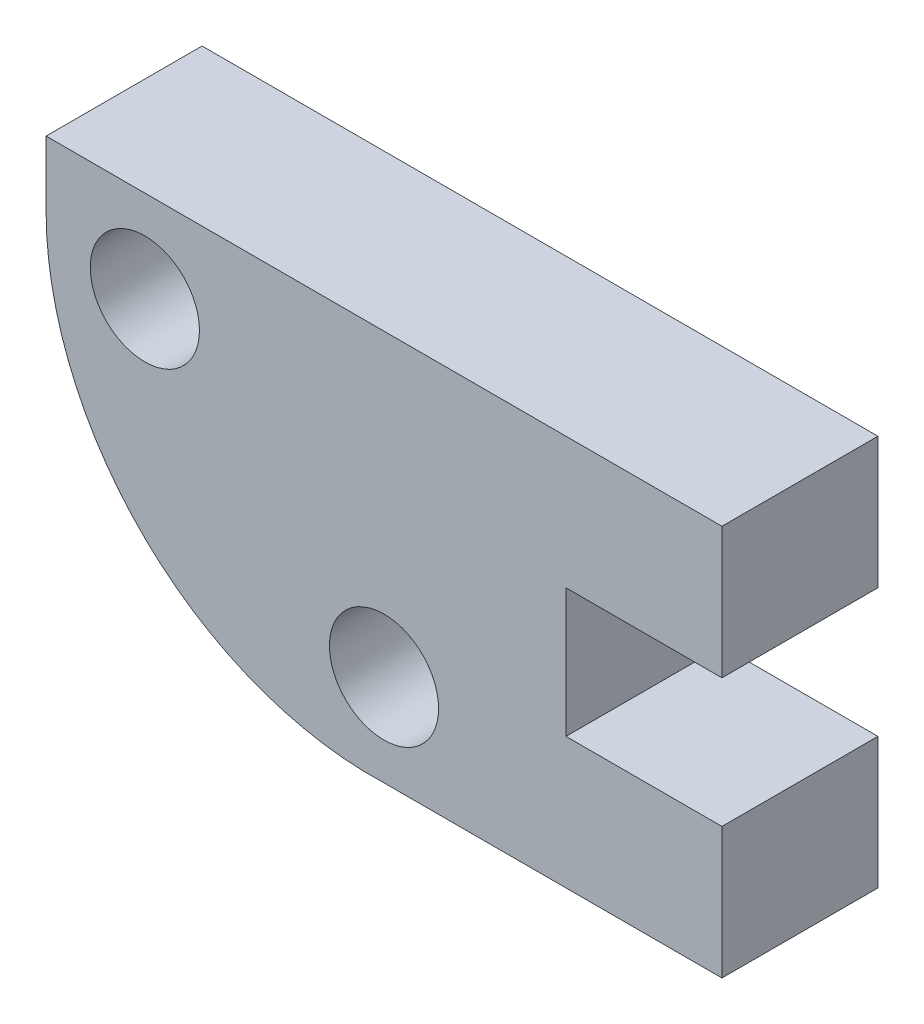
ISO-10303-21;
HEADER;
FILE_DESCRIPTION(('STEP AP214'),'2;1');
FILE_NAME('part.step','',(''),(''),'','','');
FILE_SCHEMA(('AUTOMOTIVE_DESIGN { 1 0 10303 214 1 1 1 1 }'));
ENDSEC;
DATA;
#1=APPLICATION_CONTEXT('core data for automotive mechanical design processes');
#2=APPLICATION_PROTOCOL_DEFINITION('international standard','automotive_design',2000,#1);
#3=PRODUCT_CONTEXT('',#1,'mechanical');
#4=PRODUCT('Part','Part','',(#3));
#5=PRODUCT_RELATED_PRODUCT_CATEGORY('part','',(#4));
#6=PRODUCT_DEFINITION_FORMATION('','',#4);
#7=PRODUCT_DEFINITION_CONTEXT('part definition',#1,'design');
#8=PRODUCT_DEFINITION('design','',#6,#7);
#9=PRODUCT_DEFINITION_SHAPE('','',#8);
#10=(LENGTH_UNIT() NAMED_UNIT(*) SI_UNIT(.MILLI.,.METRE.));
#11=(NAMED_UNIT(*) PLANE_ANGLE_UNIT() SI_UNIT($,.RADIAN.));
#12=(NAMED_UNIT(*) SI_UNIT($,.STERADIAN.) SOLID_ANGLE_UNIT());
#13=UNCERTAINTY_MEASURE_WITH_UNIT(LENGTH_MEASURE(1.E-05),#10,'distance_accuracy_value','');
#14=(GEOMETRIC_REPRESENTATION_CONTEXT(3) GLOBAL_UNCERTAINTY_ASSIGNED_CONTEXT((#13)) GLOBAL_UNIT_ASSIGNED_CONTEXT((#10,
#11,#12)) REPRESENTATION_CONTEXT('',''));
#15=CARTESIAN_POINT('',(0.,0.,0.));
#16=DIRECTION('',(0.,0.,1.));
#17=DIRECTION('',(1.,0.,0.));
#18=AXIS2_PLACEMENT_3D('',#15,#16,#17);
#19=CARTESIAN_POINT('',(-13.4422115384615,-2.5,6.));
#20=DIRECTION('',(0.,0.,1.));
#21=DIRECTION('',(1.,0.,0.));
#22=AXIS2_PLACEMENT_3D('',#19,#20,#21);
#23=PLANE('',#22);
#24=CARTESIAN_POINT('',(-22.2,-3.525,6.));
#25=DIRECTION('',(0.,0.,1.));
#26=DIRECTION('',(1.,0.,0.));
#27=AXIS2_PLACEMENT_3D('',#24,#25,#26);
#28=CIRCLE('',#27,2.1);
#29=CARTESIAN_POINT('',(-20.1,-3.525,6.));
#30=VERTEX_POINT('',#29);
#31=EDGE_CURVE('E156',#30,#30,#28,.T.);
#32=ORIENTED_EDGE('',*,*,#31,.F.);
#33=EDGE_LOOP('',(#32));
#34=FACE_BOUND('',#33,.T.);
#35=DIRECTION('',(-1.,0.,0.));
#36=VECTOR('',#35,1.);
#37=CARTESIAN_POINT('',(-26.,0.,6.));
#38=LINE('',#37,#36);
#39=CARTESIAN_POINT('',(0.,0.,6.));
#40=VERTEX_POINT('',#39);
#41=CARTESIAN_POINT('',(-26.,0.,6.));
#42=VERTEX_POINT('',#41);
#43=EDGE_CURVE('E177',#40,#42,#38,.T.);
#44=ORIENTED_EDGE('',*,*,#43,.T.);
#45=DIRECTION('',(0.,-1.,0.));
#46=VECTOR('',#45,1.);
#47=CARTESIAN_POINT('',(-26.,0.,6.));
#48=LINE('',#47,#46);
#49=CARTESIAN_POINT('',(-26.,-2.5,6.));
#50=VERTEX_POINT('',#49);
#51=EDGE_CURVE('E105',#42,#50,#48,.T.);
#52=ORIENTED_EDGE('',*,*,#51,.T.);
#53=CARTESIAN_POINT('',(-13.4422115384615,-2.5,6.));
#54=DIRECTION('',(0.,0.,1.));
#55=DIRECTION('',(1.,0.,0.));
#56=AXIS2_PLACEMENT_3D('',#53,#54,#55);
#57=CIRCLE('',#56,12.5577884615385);
#58=CARTESIAN_POINT('',(-13.,-15.05,6.));
#59=VERTEX_POINT('',#58);
#60=EDGE_CURVE('E203',#50,#59,#57,.T.);
#61=ORIENTED_EDGE('',*,*,#60,.T.);
#62=DIRECTION('',(1.,0.,0.));
#63=VECTOR('',#62,1.);
#64=CARTESIAN_POINT('',(0.,-15.05,6.));
#65=LINE('',#64,#63);
#66=CARTESIAN_POINT('',(0.,-15.05,6.));
#67=VERTEX_POINT('',#66);
#68=EDGE_CURVE('E221',#59,#67,#65,.T.);
#69=ORIENTED_EDGE('',*,*,#68,.T.);
#70=DIRECTION('',(0.,1.,0.));
#71=VECTOR('',#70,1.);
#72=CARTESIAN_POINT('',(0.,-10.,6.));
#73=LINE('',#72,#71);
#74=CARTESIAN_POINT('',(0.,-10.,6.));
#75=VERTEX_POINT('',#74);
#76=EDGE_CURVE('E219',#67,#75,#73,.T.);
#77=ORIENTED_EDGE('',*,*,#76,.T.);
#78=DIRECTION('',(-1.,0.,0.));
#79=VECTOR('',#78,1.);
#80=CARTESIAN_POINT('',(-6.,-10.,6.));
#81=LINE('',#80,#79);
#82=CARTESIAN_POINT('',(-6.,-10.,6.));
#83=VERTEX_POINT('',#82);
#84=EDGE_CURVE('E127',#75,#83,#81,.T.);
#85=ORIENTED_EDGE('',*,*,#84,.T.);
#86=DIRECTION('',(0.,1.,0.));
#87=VECTOR('',#86,1.);
#88=CARTESIAN_POINT('',(-6.,-5.05,6.));
#89=LINE('',#88,#87);
#90=CARTESIAN_POINT('',(-6.,-5.05,6.));
#91=VERTEX_POINT('',#90);
#92=EDGE_CURVE('E121',#83,#91,#89,.T.);
#93=ORIENTED_EDGE('',*,*,#92,.T.);
#94=DIRECTION('',(1.,0.,0.));
#95=VECTOR('',#94,1.);
#96=CARTESIAN_POINT('',(0.,-5.05,6.));
#97=LINE('',#96,#95);
#98=CARTESIAN_POINT('',(0.,-5.05,6.));
#99=VERTEX_POINT('',#98);
#100=EDGE_CURVE('E125',#91,#99,#97,.T.);
#101=ORIENTED_EDGE('',*,*,#100,.T.);
#102=DIRECTION('',(0.,1.,0.));
#103=VECTOR('',#102,1.);
#104=CARTESIAN_POINT('',(0.,0.,6.));
#105=LINE('',#104,#103);
#106=EDGE_CURVE('E59',#99,#40,#105,.T.);
#107=ORIENTED_EDGE('',*,*,#106,.T.);
#108=EDGE_LOOP('',(#44,#52,#61,#69,#77,#85,#93,#101,#107));
#109=FACE_BOUND('',#108,.T.);
#110=CARTESIAN_POINT('',(-13.,-11.525,6.));
#111=DIRECTION('',(0.,0.,1.));
#112=DIRECTION('',(1.,0.,0.));
#113=AXIS2_PLACEMENT_3D('',#110,#111,#112);
#114=CIRCLE('',#113,2.1);
#115=CARTESIAN_POINT('',(-10.9,-11.525,6.));
#116=VERTEX_POINT('',#115);
#117=EDGE_CURVE('E234',#116,#116,#114,.T.);
#118=ORIENTED_EDGE('',*,*,#117,.F.);
#119=EDGE_LOOP('',(#118));
#120=FACE_BOUND('',#119,.T.);
#121=ADVANCED_FACE('F41',(#34,#109,#120),#23,.T.);
#122=CARTESIAN_POINT('',(-13.4422115384615,-2.5,0.));
#123=DIRECTION('',(0.,0.,1.));
#124=DIRECTION('',(1.,0.,0.));
#125=AXIS2_PLACEMENT_3D('',#122,#123,#124);
#126=PLANE('',#125);
#127=DIRECTION('',(-1.,0.,0.));
#128=VECTOR('',#127,1.);
#129=CARTESIAN_POINT('',(-26.,0.,0.));
#130=LINE('',#129,#128);
#131=CARTESIAN_POINT('',(0.,0.,0.));
#132=VERTEX_POINT('',#131);
#133=CARTESIAN_POINT('',(-26.,0.,0.));
#134=VERTEX_POINT('',#133);
#135=EDGE_CURVE('E151',#132,#134,#130,.T.);
#136=ORIENTED_EDGE('',*,*,#135,.F.);
#137=DIRECTION('',(0.,1.,0.));
#138=VECTOR('',#137,1.);
#139=CARTESIAN_POINT('',(0.,0.,0.));
#140=LINE('',#139,#138);
#141=CARTESIAN_POINT('',(0.,-5.05,0.));
#142=VERTEX_POINT('',#141);
#143=EDGE_CURVE('E97',#142,#132,#140,.T.);
#144=ORIENTED_EDGE('',*,*,#143,.F.);
#145=DIRECTION('',(1.,0.,0.));
#146=VECTOR('',#145,1.);
#147=CARTESIAN_POINT('',(0.,-5.05,0.));
#148=LINE('',#147,#146);
#149=CARTESIAN_POINT('',(-6.,-5.05,0.));
#150=VERTEX_POINT('',#149);
#151=EDGE_CURVE('E91',#150,#142,#148,.T.);
#152=ORIENTED_EDGE('',*,*,#151,.F.);
#153=DIRECTION('',(0.,1.,0.));
#154=VECTOR('',#153,1.);
#155=CARTESIAN_POINT('',(-6.,-5.05,0.));
#156=LINE('',#155,#154);
#157=CARTESIAN_POINT('',(-6.,-10.,0.));
#158=VERTEX_POINT('',#157);
#159=EDGE_CURVE('E136',#158,#150,#156,.T.);
#160=ORIENTED_EDGE('',*,*,#159,.F.);
#161=DIRECTION('',(-1.,0.,0.));
#162=VECTOR('',#161,1.);
#163=CARTESIAN_POINT('',(-6.,-10.,0.));
#164=LINE('',#163,#162);
#165=CARTESIAN_POINT('',(0.,-10.,0.));
#166=VERTEX_POINT('',#165);
#167=EDGE_CURVE('E168',#166,#158,#164,.T.);
#168=ORIENTED_EDGE('',*,*,#167,.F.);
#169=DIRECTION('',(0.,1.,0.));
#170=VECTOR('',#169,1.);
#171=CARTESIAN_POINT('',(0.,-10.,0.));
#172=LINE('',#171,#170);
#173=CARTESIAN_POINT('',(0.,-15.05,0.));
#174=VERTEX_POINT('',#173);
#175=EDGE_CURVE('E165',#174,#166,#172,.T.);
#176=ORIENTED_EDGE('',*,*,#175,.F.);
#177=DIRECTION('',(1.,0.,0.));
#178=VECTOR('',#177,1.);
#179=CARTESIAN_POINT('',(0.,-15.05,0.));
#180=LINE('',#179,#178);
#181=CARTESIAN_POINT('',(-13.,-15.05,0.));
#182=VERTEX_POINT('',#181);
#183=EDGE_CURVE('E162',#182,#174,#180,.T.);
#184=ORIENTED_EDGE('',*,*,#183,.F.);
#185=CARTESIAN_POINT('',(-13.4422115384615,-2.5,0.));
#186=DIRECTION('',(0.,0.,1.));
#187=DIRECTION('',(1.,0.,0.));
#188=AXIS2_PLACEMENT_3D('',#185,#186,#187);
#189=CIRCLE('',#188,12.5577884615385);
#190=CARTESIAN_POINT('',(-26.,-2.5,0.));
#191=VERTEX_POINT('',#190);
#192=EDGE_CURVE('E159',#191,#182,#189,.T.);
#193=ORIENTED_EDGE('',*,*,#192,.F.);
#194=DIRECTION('',(0.,-1.,0.));
#195=VECTOR('',#194,1.);
#196=CARTESIAN_POINT('',(-26.,0.,0.));
#197=LINE('',#196,#195);
#198=EDGE_CURVE('E155',#134,#191,#197,.T.);
#199=ORIENTED_EDGE('',*,*,#198,.F.);
#200=EDGE_LOOP('',(#136,#144,#152,#160,#168,#176,#184,#193,#199));
#201=FACE_BOUND('',#200,.T.);
#202=CARTESIAN_POINT('',(-22.2,-3.525,0.));
#203=DIRECTION('',(0.,0.,1.));
#204=DIRECTION('',(1.,0.,0.));
#205=AXIS2_PLACEMENT_3D('',#202,#203,#204);
#206=CIRCLE('',#205,2.1);
#207=CARTESIAN_POINT('',(-20.1,-3.525,0.));
#208=VERTEX_POINT('',#207);
#209=EDGE_CURVE('E231',#208,#208,#206,.T.);
#210=ORIENTED_EDGE('',*,*,#209,.T.);
#211=EDGE_LOOP('',(#210));
#212=FACE_BOUND('',#211,.T.);
#213=CARTESIAN_POINT('',(-13.,-11.525,0.));
#214=DIRECTION('',(0.,0.,1.));
#215=DIRECTION('',(1.,0.,0.));
#216=AXIS2_PLACEMENT_3D('',#213,#214,#215);
#217=CIRCLE('',#216,2.1);
#218=CARTESIAN_POINT('',(-10.9,-11.525,0.));
#219=VERTEX_POINT('',#218);
#220=EDGE_CURVE('E238',#219,#219,#217,.T.);
#221=ORIENTED_EDGE('',*,*,#220,.T.);
#222=EDGE_LOOP('',(#221));
#223=FACE_BOUND('',#222,.T.);
#224=ADVANCED_FACE('F207',(#201,#212,#223),#126,.F.);
#225=CARTESIAN_POINT('',(-26.,0.,6.));
#226=DIRECTION('',(0.,-1.,0.));
#227=DIRECTION('',(0.,0.,-1.));
#228=AXIS2_PLACEMENT_3D('',#225,#226,#227);
#229=PLANE('',#228);
#230=ORIENTED_EDGE('',*,*,#135,.T.);
#231=DIRECTION('',(0.,0.,-1.));
#232=VECTOR('',#231,1.);
#233=CARTESIAN_POINT('',(-26.,0.,6.));
#234=LINE('',#233,#232);
#235=EDGE_CURVE('E11',#42,#134,#234,.T.);
#236=ORIENTED_EDGE('',*,*,#235,.F.);
#237=ORIENTED_EDGE('',*,*,#43,.F.);
#238=DIRECTION('',(0.,0.,-1.));
#239=VECTOR('',#238,1.);
#240=CARTESIAN_POINT('',(0.,0.,6.));
#241=LINE('',#240,#239);
#242=EDGE_CURVE('E147',#40,#132,#241,.T.);
#243=ORIENTED_EDGE('',*,*,#242,.T.);
#244=EDGE_LOOP('',(#230,#236,#237,#243));
#245=FACE_BOUND('',#244,.T.);
#246=ADVANCED_FACE('F43',(#245),#229,.F.);
#247=CARTESIAN_POINT('',(-26.,0.,6.));
#248=DIRECTION('',(1.,0.,0.));
#249=DIRECTION('',(0.,0.,-1.));
#250=AXIS2_PLACEMENT_3D('',#247,#248,#249);
#251=PLANE('',#250);
#252=ORIENTED_EDGE('',*,*,#198,.T.);
#253=DIRECTION('',(0.,0.,-1.));
#254=VECTOR('',#253,1.);
#255=CARTESIAN_POINT('',(-26.,-2.5,6.));
#256=LINE('',#255,#254);
#257=EDGE_CURVE('E51',#50,#191,#256,.T.);
#258=ORIENTED_EDGE('',*,*,#257,.F.);
#259=ORIENTED_EDGE('',*,*,#51,.F.);
#260=ORIENTED_EDGE('',*,*,#235,.T.);
#261=EDGE_LOOP('',(#252,#258,#259,#260));
#262=FACE_BOUND('',#261,.T.);
#263=ADVANCED_FACE('F275',(#262),#251,.F.);
#264=CARTESIAN_POINT('',(-13.4422115384615,-2.5,6.));
#265=DIRECTION('',(0.,0.,-1.));
#266=DIRECTION('',(-1.,0.,0.));
#267=AXIS2_PLACEMENT_3D('',#264,#265,#266);
#268=CYLINDRICAL_SURFACE('',#267,12.5577884615385);
#269=ORIENTED_EDGE('',*,*,#192,.T.);
#270=DIRECTION('',(0.,0.,-1.));
#271=VECTOR('',#270,1.);
#272=CARTESIAN_POINT('',(-13.,-15.05,6.));
#273=LINE('',#272,#271);
#274=EDGE_CURVE('E191',#59,#182,#273,.T.);
#275=ORIENTED_EDGE('',*,*,#274,.F.);
#276=ORIENTED_EDGE('',*,*,#60,.F.);
#277=ORIENTED_EDGE('',*,*,#257,.T.);
#278=EDGE_LOOP('',(#269,#275,#276,#277));
#279=FACE_BOUND('',#278,.T.);
#280=ADVANCED_FACE('F201',(#279),#268,.T.);
#281=CARTESIAN_POINT('',(0.,-15.05,6.));
#282=DIRECTION('',(0.,1.,0.));
#283=DIRECTION('',(-1.,0.,0.));
#284=AXIS2_PLACEMENT_3D('',#281,#282,#283);
#285=PLANE('',#284);
#286=ORIENTED_EDGE('',*,*,#183,.T.);
#287=DIRECTION('',(0.,0.,-1.));
#288=VECTOR('',#287,1.);
#289=CARTESIAN_POINT('',(0.,-15.05,6.));
#290=LINE('',#289,#288);
#291=EDGE_CURVE('E187',#67,#174,#290,.T.);
#292=ORIENTED_EDGE('',*,*,#291,.F.);
#293=ORIENTED_EDGE('',*,*,#68,.F.);
#294=ORIENTED_EDGE('',*,*,#274,.T.);
#295=EDGE_LOOP('',(#286,#292,#293,#294));
#296=FACE_BOUND('',#295,.T.);
#297=ADVANCED_FACE('F213',(#296),#285,.F.);
#298=CARTESIAN_POINT('',(0.,-10.,6.));
#299=DIRECTION('',(-1.,0.,0.));
#300=DIRECTION('',(0.,-1.,0.));
#301=AXIS2_PLACEMENT_3D('',#298,#299,#300);
#302=PLANE('',#301);
#303=ORIENTED_EDGE('',*,*,#175,.T.);
#304=DIRECTION('',(0.,0.,-1.));
#305=VECTOR('',#304,1.);
#306=CARTESIAN_POINT('',(0.,-10.,6.));
#307=LINE('',#306,#305);
#308=EDGE_CURVE('E183',#75,#166,#307,.T.);
#309=ORIENTED_EDGE('',*,*,#308,.F.);
#310=ORIENTED_EDGE('',*,*,#76,.F.);
#311=ORIENTED_EDGE('',*,*,#291,.T.);
#312=EDGE_LOOP('',(#303,#309,#310,#311));
#313=FACE_BOUND('',#312,.T.);
#314=ADVANCED_FACE('F217',(#313),#302,.F.);
#315=CARTESIAN_POINT('',(-6.,-10.,6.));
#316=DIRECTION('',(0.,-1.,0.));
#317=DIRECTION('',(0.,0.,-1.));
#318=AXIS2_PLACEMENT_3D('',#315,#316,#317);
#319=PLANE('',#318);
#320=ORIENTED_EDGE('',*,*,#167,.T.);
#321=DIRECTION('',(0.,0.,-1.));
#322=VECTOR('',#321,1.);
#323=CARTESIAN_POINT('',(-6.,-10.,6.));
#324=LINE('',#323,#322);
#325=EDGE_CURVE('E138',#83,#158,#324,.T.);
#326=ORIENTED_EDGE('',*,*,#325,.F.);
#327=ORIENTED_EDGE('',*,*,#84,.F.);
#328=ORIENTED_EDGE('',*,*,#308,.T.);
#329=EDGE_LOOP('',(#320,#326,#327,#328));
#330=FACE_BOUND('',#329,.T.);
#331=ADVANCED_FACE('F266',(#330),#319,.F.);
#332=CARTESIAN_POINT('',(-6.,-5.05,6.));
#333=DIRECTION('',(-1.,0.,0.));
#334=DIRECTION('',(0.,-1.,0.));
#335=AXIS2_PLACEMENT_3D('',#332,#333,#334);
#336=PLANE('',#335);
#337=ORIENTED_EDGE('',*,*,#159,.T.);
#338=DIRECTION('',(0.,0.,-1.));
#339=VECTOR('',#338,1.);
#340=CARTESIAN_POINT('',(-6.,-5.05,6.));
#341=LINE('',#340,#339);
#342=EDGE_CURVE('E133',#91,#150,#341,.T.);
#343=ORIENTED_EDGE('',*,*,#342,.F.);
#344=ORIENTED_EDGE('',*,*,#92,.F.);
#345=ORIENTED_EDGE('',*,*,#325,.T.);
#346=EDGE_LOOP('',(#337,#343,#344,#345));
#347=FACE_BOUND('',#346,.T.);
#348=ADVANCED_FACE('F134',(#347),#336,.F.);
#349=CARTESIAN_POINT('',(0.,-5.05,6.));
#350=DIRECTION('',(0.,1.,0.));
#351=DIRECTION('',(-1.,0.,0.));
#352=AXIS2_PLACEMENT_3D('',#349,#350,#351);
#353=PLANE('',#352);
#354=ORIENTED_EDGE('',*,*,#151,.T.);
#355=DIRECTION('',(0.,0.,-1.));
#356=VECTOR('',#355,1.);
#357=CARTESIAN_POINT('',(0.,-5.05,6.));
#358=LINE('',#357,#356);
#359=EDGE_CURVE('E139',#99,#142,#358,.T.);
#360=ORIENTED_EDGE('',*,*,#359,.F.);
#361=ORIENTED_EDGE('',*,*,#100,.F.);
#362=ORIENTED_EDGE('',*,*,#342,.T.);
#363=EDGE_LOOP('',(#354,#360,#361,#362));
#364=FACE_BOUND('',#363,.T.);
#365=ADVANCED_FACE('F141',(#364),#353,.F.);
#366=CARTESIAN_POINT('',(0.,0.,6.));
#367=DIRECTION('',(-1.,0.,0.));
#368=DIRECTION('',(0.,-1.,0.));
#369=AXIS2_PLACEMENT_3D('',#366,#367,#368);
#370=PLANE('',#369);
#371=ORIENTED_EDGE('',*,*,#143,.T.);
#372=ORIENTED_EDGE('',*,*,#242,.F.);
#373=ORIENTED_EDGE('',*,*,#106,.F.);
#374=ORIENTED_EDGE('',*,*,#359,.T.);
#375=EDGE_LOOP('',(#371,#372,#373,#374));
#376=FACE_BOUND('',#375,.T.);
#377=ADVANCED_FACE('F259',(#376),#370,.F.);
#378=CARTESIAN_POINT('',(-22.2,-3.525,6.));
#379=DIRECTION('',(0.,0.,-1.));
#380=DIRECTION('',(-1.,0.,0.));
#381=AXIS2_PLACEMENT_3D('',#378,#379,#380);
#382=CYLINDRICAL_SURFACE('',#381,2.1);
#383=ORIENTED_EDGE('',*,*,#31,.T.);
#384=EDGE_LOOP('',(#383));
#385=FACE_BOUND('',#384,.T.);
#386=ORIENTED_EDGE('',*,*,#209,.F.);
#387=EDGE_LOOP('',(#386));
#388=FACE_BOUND('',#387,.T.);
#389=ADVANCED_FACE('F256',(#385,#388),#382,.F.);
#390=CARTESIAN_POINT('',(-13.,-11.525,6.));
#391=DIRECTION('',(0.,0.,-1.));
#392=DIRECTION('',(-1.,0.,0.));
#393=AXIS2_PLACEMENT_3D('',#390,#391,#392);
#394=CYLINDRICAL_SURFACE('',#393,2.1);
#395=ORIENTED_EDGE('',*,*,#117,.T.);
#396=EDGE_LOOP('',(#395));
#397=FACE_BOUND('',#396,.T.);
#398=ORIENTED_EDGE('',*,*,#220,.F.);
#399=EDGE_LOOP('',(#398));
#400=FACE_BOUND('',#399,.T.);
#401=ADVANCED_FACE('F246',(#397,#400),#394,.F.);
#402=CLOSED_SHELL('',(#121,#224,#246,#263,#280,#297,#314,#331,#348,#365,#377,#389,#401));
#403=MANIFOLD_SOLID_BREP('B2',#402);
#404=ADVANCED_BREP_SHAPE_REPRESENTATION('',(#18,#403),#14);
#405=SHAPE_DEFINITION_REPRESENTATION(#9,#404);
ENDSEC;
END-ISO-10303-21;
